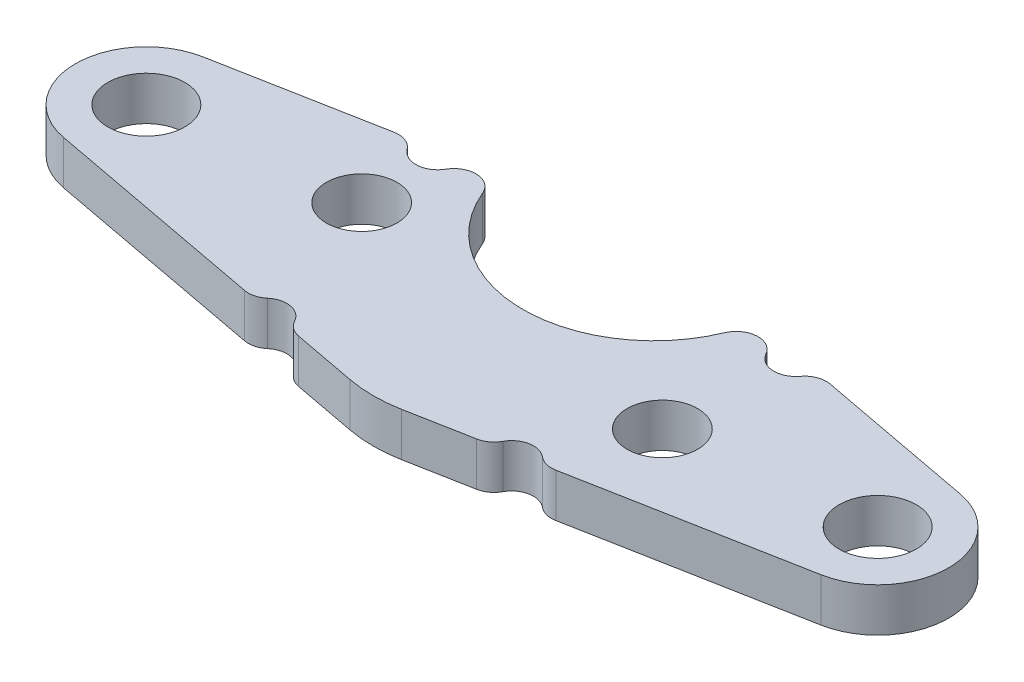
ISO-10303-21;
HEADER;
FILE_DESCRIPTION(('STEP AP214'),'2;1');
FILE_NAME('part.step','',(''),(''),'','','');
FILE_SCHEMA(('AUTOMOTIVE_DESIGN { 1 0 10303 214 1 1 1 1 }'));
ENDSEC;
DATA;
#1=APPLICATION_CONTEXT('core data for automotive mechanical design processes');
#2=APPLICATION_PROTOCOL_DEFINITION('international standard','automotive_design',2000,#1);
#3=PRODUCT_CONTEXT('',#1,'mechanical');
#4=PRODUCT('Part','Part','',(#3));
#5=PRODUCT_RELATED_PRODUCT_CATEGORY('part','',(#4));
#6=PRODUCT_DEFINITION_FORMATION('','',#4);
#7=PRODUCT_DEFINITION_CONTEXT('part definition',#1,'design');
#8=PRODUCT_DEFINITION('design','',#6,#7);
#9=PRODUCT_DEFINITION_SHAPE('','',#8);
#10=(LENGTH_UNIT() NAMED_UNIT(*) SI_UNIT(.MILLI.,.METRE.));
#11=(NAMED_UNIT(*) PLANE_ANGLE_UNIT() SI_UNIT($,.RADIAN.));
#12=(NAMED_UNIT(*) SI_UNIT($,.STERADIAN.) SOLID_ANGLE_UNIT());
#13=UNCERTAINTY_MEASURE_WITH_UNIT(LENGTH_MEASURE(1.E-05),#10,'distance_accuracy_value','');
#14=(GEOMETRIC_REPRESENTATION_CONTEXT(3) GLOBAL_UNCERTAINTY_ASSIGNED_CONTEXT((#13)) GLOBAL_UNIT_ASSIGNED_CONTEXT((#10,
#11,#12)) REPRESENTATION_CONTEXT('',''));
#15=CARTESIAN_POINT('',(0.,0.,0.));
#16=DIRECTION('',(0.,0.,1.));
#17=DIRECTION('',(1.,0.,0.));
#18=AXIS2_PLACEMENT_3D('',#15,#16,#17);
#19=CARTESIAN_POINT('',(-6.46165739404907,0.,-3.80797776347762));
#20=DIRECTION('',(0.,1.,0.));
#21=DIRECTION('',(-0.923093913435582,0.,0.384574605217483));
#22=AXIS2_PLACEMENT_3D('',#19,#20,#21);
#23=CYLINDRICAL_SURFACE('',#22,1.);
#24=CARTESIAN_POINT('',(-6.46165739404907,0.,-3.80797776347762));
#25=DIRECTION('',(0.,1.,0.));
#26=DIRECTION('',(-0.923093913435582,0.,0.384574605217483));
#27=AXIS2_PLACEMENT_3D('',#24,#25,#26);
#28=CIRCLE('',#27,1.);
#29=CARTESIAN_POINT('',(-5.53856348061349,0.,-4.1925523686951));
#30=VERTEX_POINT('',#29);
#31=CARTESIAN_POINT('',(-7.33082869702453,0.,-4.30248888173881));
#32=VERTEX_POINT('',#31);
#33=EDGE_CURVE('E11',#30,#32,#28,.T.);
#34=ORIENTED_EDGE('',*,*,#33,.T.);
#35=DIRECTION('',(0.,1.,0.));
#36=VECTOR('',#35,1.);
#37=CARTESIAN_POINT('',(-7.33082869702453,0.,-4.30248888173881));
#38=LINE('',#37,#36);
#39=CARTESIAN_POINT('',(-7.33082869702453,2.,-4.30248888173881));
#40=VERTEX_POINT('',#39);
#41=EDGE_CURVE('E50',#32,#40,#38,.T.);
#42=ORIENTED_EDGE('',*,*,#41,.T.);
#43=CARTESIAN_POINT('',(-6.46165739404907,2.,-3.80797776347762));
#44=DIRECTION('',(0.,-1.,0.));
#45=DIRECTION('',(-0.923093913435582,0.,0.384574605217483));
#46=AXIS2_PLACEMENT_3D('',#43,#44,#45);
#47=CIRCLE('',#46,1.);
#48=CARTESIAN_POINT('',(-5.53856348061349,2.,-4.1925523686951));
#49=VERTEX_POINT('',#48);
#50=EDGE_CURVE('E244',#40,#49,#47,.T.);
#51=ORIENTED_EDGE('',*,*,#50,.T.);
#52=DIRECTION('',(0.,-1.,0.));
#53=VECTOR('',#52,1.);
#54=CARTESIAN_POINT('',(-5.53856348061349,0.,-4.1925523686951));
#55=LINE('',#54,#53);
#56=EDGE_CURVE('E242',#49,#30,#55,.T.);
#57=ORIENTED_EDGE('',*,*,#56,.T.);
#58=EDGE_LOOP('',(#34,#42,#51,#57));
#59=FACE_BOUND('',#58,.T.);
#60=ADVANCED_FACE('F40',(#59),#23,.T.);
#61=CARTESIAN_POINT('',(-8.2,0.,-4.797));
#62=DIRECTION('',(0.,1.,0.));
#63=DIRECTION('',(1.,0.,0.));
#64=AXIS2_PLACEMENT_3D('',#61,#62,#63);
#65=CYLINDRICAL_SURFACE('',#64,1.);
#66=ORIENTED_EDGE('',*,*,#41,.F.);
#67=CARTESIAN_POINT('',(-8.2,0.,-4.797));
#68=DIRECTION('',(0.,1.,0.));
#69=DIRECTION('',(1.,0.,0.));
#70=AXIS2_PLACEMENT_3D('',#67,#68,#69);
#71=CIRCLE('',#70,1.);
#72=CARTESIAN_POINT('',(-9.00038306399776,0.,-4.19751109195786));
#73=VERTEX_POINT('',#72);
#74=EDGE_CURVE('E251',#73,#32,#71,.T.);
#75=ORIENTED_EDGE('',*,*,#74,.F.);
#76=DIRECTION('',(0.,-1.,0.));
#77=VECTOR('',#76,1.);
#78=CARTESIAN_POINT('',(-9.00038306399776,0.,-4.19751109195786));
#79=LINE('',#78,#77);
#80=CARTESIAN_POINT('',(-9.00038306399776,2.,-4.19751109195786));
#81=VERTEX_POINT('',#80);
#82=EDGE_CURVE('E335',#81,#73,#79,.T.);
#83=ORIENTED_EDGE('',*,*,#82,.F.);
#84=CARTESIAN_POINT('',(-8.2,2.,-4.797));
#85=DIRECTION('',(0.,-1.,0.));
#86=DIRECTION('',(1.,0.,0.));
#87=AXIS2_PLACEMENT_3D('',#84,#85,#86);
#88=CIRCLE('',#87,1.);
#89=EDGE_CURVE('E296',#40,#81,#88,.T.);
#90=ORIENTED_EDGE('',*,*,#89,.F.);
#91=EDGE_LOOP('',(#66,#75,#83,#90));
#92=FACE_BOUND('',#91,.T.);
#93=ADVANCED_FACE('F422',(#92),#65,.F.);
#94=CARTESIAN_POINT('',(-16.75,0.,0.));
#95=DIRECTION('',(0.,1.,0.));
#96=DIRECTION('',(1.,0.,0.));
#97=AXIS2_PLACEMENT_3D('',#94,#95,#96);
#98=PLANE('',#97);
#99=CARTESIAN_POINT('',(-16.75,0.,0.));
#100=DIRECTION('',(0.,1.,0.));
#101=DIRECTION('',(0.,0.,1.));
#102=AXIS2_PLACEMENT_3D('',#99,#100,#101);
#103=CIRCLE('',#102,1.76644);
#104=CARTESIAN_POINT('',(-16.75,0.,1.76644));
#105=VERTEX_POINT('',#104);
#106=EDGE_CURVE('E469',#105,#105,#103,.T.);
#107=ORIENTED_EDGE('',*,*,#106,.T.);
#108=EDGE_LOOP('',(#107));
#109=FACE_BOUND('',#108,.T.);
#110=CARTESIAN_POINT('',(16.75,0.,0.));
#111=DIRECTION('',(0.,1.,0.));
#112=DIRECTION('',(0.,0.,1.));
#113=AXIS2_PLACEMENT_3D('',#110,#111,#112);
#114=CIRCLE('',#113,1.76644);
#115=CARTESIAN_POINT('',(16.75,0.,1.76644));
#116=VERTEX_POINT('',#115);
#117=EDGE_CURVE('E473',#116,#116,#114,.T.);
#118=ORIENTED_EDGE('',*,*,#117,.T.);
#119=EDGE_LOOP('',(#118));
#120=FACE_BOUND('',#119,.T.);
#121=CARTESIAN_POINT('',(7.93155889099048,0.,1.04420953776041));
#122=DIRECTION('',(0.,1.,0.));
#123=DIRECTION('',(0.,0.,1.));
#124=AXIS2_PLACEMENT_3D('',#121,#122,#123);
#125=CIRCLE('',#124,1.61743);
#126=CARTESIAN_POINT('',(7.93155889099048,0.,2.66163953776041));
#127=VERTEX_POINT('',#126);
#128=EDGE_CURVE('E477',#127,#127,#125,.T.);
#129=ORIENTED_EDGE('',*,*,#128,.T.);
#130=EDGE_LOOP('',(#129));
#131=FACE_BOUND('',#130,.T.);
#132=CARTESIAN_POINT('',(-7.93155889099048,0.,-1.04420953776041));
#133=DIRECTION('',(0.,1.,0.));
#134=DIRECTION('',(0.,0.,1.));
#135=AXIS2_PLACEMENT_3D('',#132,#133,#134);
#136=CIRCLE('',#135,1.61743);
#137=CARTESIAN_POINT('',(-7.93155889099048,0.,0.57322046223959));
#138=VERTEX_POINT('',#137);
#139=EDGE_CURVE('E375',#138,#138,#136,.T.);
#140=ORIENTED_EDGE('',*,*,#139,.T.);
#141=EDGE_LOOP('',(#140));
#142=FACE_BOUND('',#141,.T.);
#143=ORIENTED_EDGE('',*,*,#33,.F.);
#144=CARTESIAN_POINT('',(0.,0.,-6.5));
#145=DIRECTION('',(0.,1.,0.));
#146=DIRECTION('',(1.,0.,0.));
#147=AXIS2_PLACEMENT_3D('',#144,#145,#146);
#148=CIRCLE('',#147,6.);
#149=CARTESIAN_POINT('',(5.53856348061349,0.,-4.1925523686951));
#150=VERTEX_POINT('',#149);
#151=EDGE_CURVE('E245',#30,#150,#148,.T.);
#152=ORIENTED_EDGE('',*,*,#151,.T.);
#153=CARTESIAN_POINT('',(6.46165739404907,0.,-3.80797776347762));
#154=DIRECTION('',(0.,1.,0.));
#155=DIRECTION('',(-0.869171302975464,0.,0.494511118261191));
#156=AXIS2_PLACEMENT_3D('',#153,#154,#155);
#157=CIRCLE('',#156,1.);
#158=CARTESIAN_POINT('',(7.33082869702454,0.,-4.30248888173881));
#159=VERTEX_POINT('',#158);
#160=EDGE_CURVE('E292',#159,#150,#157,.T.);
#161=ORIENTED_EDGE('',*,*,#160,.F.);
#162=CARTESIAN_POINT('',(8.2,0.,-4.797));
#163=DIRECTION('',(0.,1.,0.));
#164=DIRECTION('',(1.,0.,0.));
#165=AXIS2_PLACEMENT_3D('',#162,#163,#164);
#166=CIRCLE('',#165,1.);
#167=CARTESIAN_POINT('',(9.00038306399776,0.,-4.19751109195786));
#168=VERTEX_POINT('',#167);
#169=EDGE_CURVE('E323',#159,#168,#166,.T.);
#170=ORIENTED_EDGE('',*,*,#169,.T.);
#171=CARTESIAN_POINT('',(9.80076612799552,0.,-3.59802218391572));
#172=DIRECTION('',(0.,1.,0.));
#173=DIRECTION('',(-0.362464232443819,0.,-0.931997682507265));
#174=AXIS2_PLACEMENT_3D('',#171,#172,#173);
#175=CIRCLE('',#174,1.);
#176=CARTESIAN_POINT('',(9.9858063465176,0.,-4.58075313261394));
#177=VERTEX_POINT('',#176);
#178=EDGE_CURVE('E231',#177,#168,#175,.T.);
#179=ORIENTED_EDGE('',*,*,#178,.F.);
#180=DIRECTION('',(-0.982730948698219,0.,-0.185040218522078));
#181=VECTOR('',#180,1.);
#182=CARTESIAN_POINT('',(17.3513807101968,0.,-3.19387558326921));
#183=LINE('',#182,#181);
#184=CARTESIAN_POINT('',(17.3513807101968,0.,-3.19387558326921));
#185=VERTEX_POINT('',#184);
#186=EDGE_CURVE('E209',#185,#177,#183,.T.);
#187=ORIENTED_EDGE('',*,*,#186,.F.);
#188=CARTESIAN_POINT('',(16.75,0.,0.));
#189=DIRECTION('',(0.,1.,0.));
#190=DIRECTION('',(1.,0.,0.));
#191=AXIS2_PLACEMENT_3D('',#188,#189,#190);
#192=CIRCLE('',#191,3.25);
#193=CARTESIAN_POINT('',(17.3513807101968,0.,3.19387558326921));
#194=VERTEX_POINT('',#193);
#195=EDGE_CURVE('E205',#194,#185,#192,.T.);
#196=ORIENTED_EDGE('',*,*,#195,.F.);
#197=DIRECTION('',(0.982730948698219,0.,-0.185040218522078));
#198=VECTOR('',#197,1.);
#199=CARTESIAN_POINT('',(1.17489874158095,0.,6.2397751373193));
#200=LINE('',#199,#198);
#201=CARTESIAN_POINT('',(7.12605313628814,0.,5.11922132641718));
#202=VERTEX_POINT('',#201);
#203=EDGE_CURVE('E191',#202,#194,#200,.T.);
#204=ORIENTED_EDGE('',*,*,#203,.F.);
#205=CARTESIAN_POINT('',(6.94101291776606,0.,4.13649037771896));
#206=DIRECTION('',(0.,1.,0.));
#207=DIRECTION('',(-0.254941026186371,0.,0.966956603559353));
#208=AXIS2_PLACEMENT_3D('',#205,#206,#207);
#209=CIRCLE('',#208,1.);
#210=CARTESIAN_POINT('',(6.29550645888303,0.,4.90024518885948));
#211=VERTEX_POINT('',#210);
#212=EDGE_CURVE('E259',#211,#202,#209,.T.);
#213=ORIENTED_EDGE('',*,*,#212,.F.);
#214=CARTESIAN_POINT('',(5.65,0.,5.664));
#215=DIRECTION('',(0.,1.,0.));
#216=DIRECTION('',(1.,0.,0.));
#217=AXIS2_PLACEMENT_3D('',#214,#215,#216);
#218=CIRCLE('',#217,1.);
#219=CARTESIAN_POINT('',(4.77092806707373,0.,5.1873108594259));
#220=VERTEX_POINT('',#219);
#221=EDGE_CURVE('E320',#211,#220,#218,.T.);
#222=ORIENTED_EDGE('',*,*,#221,.T.);
#223=CARTESIAN_POINT('',(3.89185613414746,0.,4.71062171885181));
#224=DIRECTION('',(0.,1.,0.));
#225=DIRECTION('',(0.589154687333803,0.,0.808020268553091));
#226=AXIS2_PLACEMENT_3D('',#223,#224,#225);
#227=CIRCLE('',#226,1.);
#228=CARTESIAN_POINT('',(4.07689635266954,0.,5.69335266755003));
#229=VERTEX_POINT('',#228);
#230=EDGE_CURVE('E226',#229,#220,#227,.T.);
#231=ORIENTED_EDGE('',*,*,#230,.F.);
#232=DIRECTION('',(0.982730948698219,0.,-0.185040218522078));
#233=VECTOR('',#232,1.);
#234=CARTESIAN_POINT('',(1.17489874158095,0.,6.2397751373193));
#235=LINE('',#234,#233);
#236=CARTESIAN_POINT('',(1.17489874158095,0.,6.2397751373193));
#237=VERTEX_POINT('',#236);
#238=EDGE_CURVE('E218',#237,#229,#235,.T.);
#239=ORIENTED_EDGE('',*,*,#238,.F.);
#240=CARTESIAN_POINT('',(0.,0.,0.));
#241=DIRECTION('',(0.,1.,0.));
#242=DIRECTION('',(1.,0.,0.));
#243=AXIS2_PLACEMENT_3D('',#240,#241,#242);
#244=CIRCLE('',#243,6.34942366024481);
#245=CARTESIAN_POINT('',(-1.17489874158095,0.,6.2397751373193));
#246=VERTEX_POINT('',#245);
#247=EDGE_CURVE('E220',#246,#237,#244,.T.);
#248=ORIENTED_EDGE('',*,*,#247,.F.);
#249=DIRECTION('',(-0.982730948698219,0.,-0.185040218522078));
#250=VECTOR('',#249,1.);
#251=CARTESIAN_POINT('',(-1.17489874158095,0.,6.2397751373193));
#252=LINE('',#251,#250);
#253=CARTESIAN_POINT('',(-4.07689635266954,0.,5.69335266755003));
#254=VERTEX_POINT('',#253);
#255=EDGE_CURVE('E324',#246,#254,#252,.T.);
#256=ORIENTED_EDGE('',*,*,#255,.T.);
#257=CARTESIAN_POINT('',(-3.89185613414746,0.,4.71062171885181));
#258=DIRECTION('',(0.,1.,0.));
#259=DIRECTION('',(-0.589154687333803,0.,0.808020268553091));
#260=AXIS2_PLACEMENT_3D('',#257,#258,#259);
#261=CIRCLE('',#260,1.);
#262=CARTESIAN_POINT('',(-4.77092806707373,0.,5.1873108594259));
#263=VERTEX_POINT('',#262);
#264=EDGE_CURVE('E250',#263,#254,#261,.T.);
#265=ORIENTED_EDGE('',*,*,#264,.F.);
#266=CARTESIAN_POINT('',(-5.65,0.,5.664));
#267=DIRECTION('',(0.,1.,0.));
#268=DIRECTION('',(1.,0.,0.));
#269=AXIS2_PLACEMENT_3D('',#266,#267,#268);
#270=CIRCLE('',#269,1.);
#271=CARTESIAN_POINT('',(-6.29550645888303,0.,4.90024518885948));
#272=VERTEX_POINT('',#271);
#273=EDGE_CURVE('E263',#263,#272,#270,.T.);
#274=ORIENTED_EDGE('',*,*,#273,.T.);
#275=CARTESIAN_POINT('',(-6.94101291776606,0.,4.13649037771896));
#276=DIRECTION('',(0.,1.,0.));
#277=DIRECTION('',(0.254941026186371,0.,0.966956603559353));
#278=AXIS2_PLACEMENT_3D('',#275,#276,#277);
#279=CIRCLE('',#278,1.);
#280=CARTESIAN_POINT('',(-7.12605313628814,0.,5.11922132641718));
#281=VERTEX_POINT('',#280);
#282=EDGE_CURVE('E306',#281,#272,#279,.T.);
#283=ORIENTED_EDGE('',*,*,#282,.F.);
#284=DIRECTION('',(-0.982730948698219,0.,-0.185040218522078));
#285=VECTOR('',#284,1.);
#286=CARTESIAN_POINT('',(-1.17489874158095,0.,6.2397751373193));
#287=LINE('',#286,#285);
#288=CARTESIAN_POINT('',(-17.3513807101968,0.,3.19387558326921));
#289=VERTEX_POINT('',#288);
#290=EDGE_CURVE('E260',#281,#289,#287,.T.);
#291=ORIENTED_EDGE('',*,*,#290,.T.);
#292=CARTESIAN_POINT('',(-16.75,0.,0.));
#293=DIRECTION('',(0.,1.,0.));
#294=DIRECTION('',(1.,0.,0.));
#295=AXIS2_PLACEMENT_3D('',#292,#293,#294);
#296=CIRCLE('',#295,3.25);
#297=CARTESIAN_POINT('',(-17.3513807101968,0.,-3.19387558326921));
#298=VERTEX_POINT('',#297);
#299=EDGE_CURVE('E312',#298,#289,#296,.T.);
#300=ORIENTED_EDGE('',*,*,#299,.F.);
#301=DIRECTION('',(0.982730948698219,0.,-0.185040218522078));
#302=VECTOR('',#301,1.);
#303=CARTESIAN_POINT('',(-17.3513807101968,0.,-3.19387558326921));
#304=LINE('',#303,#302);
#305=CARTESIAN_POINT('',(-9.9858063465176,0.,-4.58075313261394));
#306=VERTEX_POINT('',#305);
#307=EDGE_CURVE('E254',#298,#306,#304,.T.);
#308=ORIENTED_EDGE('',*,*,#307,.T.);
#309=CARTESIAN_POINT('',(-9.80076612799552,0.,-3.59802218391572));
#310=DIRECTION('',(0.,1.,0.));
#311=DIRECTION('',(0.362464232443819,0.,-0.931997682507265));
#312=AXIS2_PLACEMENT_3D('',#309,#310,#311);
#313=CIRCLE('',#312,1.);
#314=EDGE_CURVE('E241',#73,#306,#313,.T.);
#315=ORIENTED_EDGE('',*,*,#314,.F.);
#316=ORIENTED_EDGE('',*,*,#74,.T.);
#317=EDGE_LOOP('',(#143,#152,#161,#170,#179,#187,#196,#204,#213,#222,#231,#239,#248,#256,#265,
#274,#283,#291,#300,#308,#315,#316));
#318=FACE_BOUND('',#317,.T.);
#319=ADVANCED_FACE('F207',(#109,#120,#131,#142,#318),#98,.F.);
#320=CARTESIAN_POINT('',(9.80076612799552,0.,-3.59802218391572));
#321=DIRECTION('',(0.,1.,0.));
#322=DIRECTION('',(-0.362464232443819,0.,-0.931997682507265));
#323=AXIS2_PLACEMENT_3D('',#320,#321,#322);
#324=CYLINDRICAL_SURFACE('',#323,1.);
#325=CARTESIAN_POINT('',(9.80076612799552,2.,-3.59802218391572));
#326=DIRECTION('',(0.,-1.,0.));
#327=DIRECTION('',(-0.362464232443819,0.,-0.931997682507265));
#328=AXIS2_PLACEMENT_3D('',#325,#326,#327);
#329=CIRCLE('',#328,1.);
#330=CARTESIAN_POINT('',(9.00038306399776,2.,-4.19751109195786));
#331=VERTEX_POINT('',#330);
#332=CARTESIAN_POINT('',(9.9858063465176,2.,-4.58075313261394));
#333=VERTEX_POINT('',#332);
#334=EDGE_CURVE('E237',#331,#333,#329,.T.);
#335=ORIENTED_EDGE('',*,*,#334,.T.);
#336=DIRECTION('',(0.,-1.,0.));
#337=VECTOR('',#336,1.);
#338=CARTESIAN_POINT('',(9.9858063465176,0.,-4.58075313261394));
#339=LINE('',#338,#337);
#340=EDGE_CURVE('E233',#333,#177,#339,.T.);
#341=ORIENTED_EDGE('',*,*,#340,.T.);
#342=ORIENTED_EDGE('',*,*,#178,.T.);
#343=DIRECTION('',(0.,1.,0.));
#344=VECTOR('',#343,1.);
#345=CARTESIAN_POINT('',(9.00038306399776,0.,-4.19751109195786));
#346=LINE('',#345,#344);
#347=EDGE_CURVE('E234',#168,#331,#346,.T.);
#348=ORIENTED_EDGE('',*,*,#347,.T.);
#349=EDGE_LOOP('',(#335,#341,#342,#348));
#350=FACE_BOUND('',#349,.T.);
#351=ADVANCED_FACE('F438',(#350),#324,.T.);
#352=CARTESIAN_POINT('',(8.2,0.,-4.797));
#353=DIRECTION('',(0.,1.,0.));
#354=DIRECTION('',(1.,0.,0.));
#355=AXIS2_PLACEMENT_3D('',#352,#353,#354);
#356=CYLINDRICAL_SURFACE('',#355,1.);
#357=ORIENTED_EDGE('',*,*,#347,.F.);
#358=ORIENTED_EDGE('',*,*,#169,.F.);
#359=DIRECTION('',(0.,-1.,0.));
#360=VECTOR('',#359,1.);
#361=CARTESIAN_POINT('',(7.33082869702454,0.,-4.30248888173881));
#362=LINE('',#361,#360);
#363=CARTESIAN_POINT('',(7.33082869702454,2.,-4.30248888173881));
#364=VERTEX_POINT('',#363);
#365=EDGE_CURVE('E276',#364,#159,#362,.T.);
#366=ORIENTED_EDGE('',*,*,#365,.F.);
#367=CARTESIAN_POINT('',(8.2,2.,-4.797));
#368=DIRECTION('',(0.,-1.,0.));
#369=DIRECTION('',(1.,0.,0.));
#370=AXIS2_PLACEMENT_3D('',#367,#368,#369);
#371=CIRCLE('',#370,1.);
#372=EDGE_CURVE('E300',#331,#364,#371,.T.);
#373=ORIENTED_EDGE('',*,*,#372,.F.);
#374=EDGE_LOOP('',(#357,#358,#366,#373));
#375=FACE_BOUND('',#374,.T.);
#376=ADVANCED_FACE('F436',(#375),#356,.F.);
#377=CARTESIAN_POINT('',(0.,0.,-6.5));
#378=DIRECTION('',(0.,1.,0.));
#379=DIRECTION('',(1.,0.,0.));
#380=AXIS2_PLACEMENT_3D('',#377,#378,#379);
#381=CYLINDRICAL_SURFACE('',#380,6.);
#382=ORIENTED_EDGE('',*,*,#56,.F.);
#383=CARTESIAN_POINT('',(0.,2.,-6.5));
#384=DIRECTION('',(0.,-1.,0.));
#385=DIRECTION('',(1.,0.,0.));
#386=AXIS2_PLACEMENT_3D('',#383,#384,#385);
#387=CIRCLE('',#386,6.);
#388=CARTESIAN_POINT('',(5.53856348061349,2.,-4.1925523686951));
#389=VERTEX_POINT('',#388);
#390=EDGE_CURVE('E304',#389,#49,#387,.T.);
#391=ORIENTED_EDGE('',*,*,#390,.F.);
#392=DIRECTION('',(0.,1.,0.));
#393=VECTOR('',#392,1.);
#394=CARTESIAN_POINT('',(5.53856348061349,0.,-4.1925523686951));
#395=LINE('',#394,#393);
#396=EDGE_CURVE('E289',#150,#389,#395,.T.);
#397=ORIENTED_EDGE('',*,*,#396,.F.);
#398=ORIENTED_EDGE('',*,*,#151,.F.);
#399=EDGE_LOOP('',(#382,#391,#397,#398));
#400=FACE_BOUND('',#399,.T.);
#401=ADVANCED_FACE('F42',(#400),#381,.F.);
#402=CARTESIAN_POINT('',(6.46165739404907,0.,-3.80797776347762));
#403=DIRECTION('',(0.,1.,0.));
#404=DIRECTION('',(-0.869171302975464,0.,0.494511118261191));
#405=AXIS2_PLACEMENT_3D('',#402,#403,#404);
#406=CYLINDRICAL_SURFACE('',#405,1.);
#407=ORIENTED_EDGE('',*,*,#160,.T.);
#408=ORIENTED_EDGE('',*,*,#396,.T.);
#409=CARTESIAN_POINT('',(6.46165739404907,2.,-3.80797776347762));
#410=DIRECTION('',(0.,-1.,0.));
#411=DIRECTION('',(-0.869171302975464,0.,0.494511118261191));
#412=AXIS2_PLACEMENT_3D('',#409,#410,#411);
#413=CIRCLE('',#412,1.);
#414=EDGE_CURVE('E279',#389,#364,#413,.T.);
#415=ORIENTED_EDGE('',*,*,#414,.T.);
#416=ORIENTED_EDGE('',*,*,#365,.T.);
#417=EDGE_LOOP('',(#407,#408,#415,#416));
#418=FACE_BOUND('',#417,.T.);
#419=ADVANCED_FACE('F429',(#418),#406,.T.);
#420=CARTESIAN_POINT('',(6.94101291776606,0.,4.13649037771896));
#421=DIRECTION('',(0.,1.,0.));
#422=DIRECTION('',(-0.254941026186371,0.,0.966956603559353));
#423=AXIS2_PLACEMENT_3D('',#420,#421,#422);
#424=CYLINDRICAL_SURFACE('',#423,1.);
#425=CARTESIAN_POINT('',(6.94101291776606,2.,4.13649037771896));
#426=DIRECTION('',(0.,-1.,0.));
#427=DIRECTION('',(-0.254941026186371,0.,0.966956603559353));
#428=AXIS2_PLACEMENT_3D('',#425,#426,#427);
#429=CIRCLE('',#428,1.);
#430=CARTESIAN_POINT('',(7.12605313628814,2.,5.11922132641718));
#431=VERTEX_POINT('',#430);
#432=CARTESIAN_POINT('',(6.29550645888303,2.,4.90024518885948));
#433=VERTEX_POINT('',#432);
#434=EDGE_CURVE('E258',#431,#433,#429,.T.);
#435=ORIENTED_EDGE('',*,*,#434,.T.);
#436=DIRECTION('',(0.,-1.,0.));
#437=VECTOR('',#436,1.);
#438=CARTESIAN_POINT('',(6.29550645888303,0.,4.90024518885948));
#439=LINE('',#438,#437);
#440=EDGE_CURVE('E255',#433,#211,#439,.T.);
#441=ORIENTED_EDGE('',*,*,#440,.T.);
#442=ORIENTED_EDGE('',*,*,#212,.T.);
#443=DIRECTION('',(0.,1.,0.));
#444=VECTOR('',#443,1.);
#445=CARTESIAN_POINT('',(7.12605313628814,0.,5.11922132641718));
#446=LINE('',#445,#444);
#447=EDGE_CURVE('E198',#202,#431,#446,.T.);
#448=ORIENTED_EDGE('',*,*,#447,.T.);
#449=EDGE_LOOP('',(#435,#441,#442,#448));
#450=FACE_BOUND('',#449,.T.);
#451=ADVANCED_FACE('F442',(#450),#424,.T.);
#452=CARTESIAN_POINT('',(5.65,0.,5.664));
#453=DIRECTION('',(0.,1.,0.));
#454=DIRECTION('',(1.,0.,0.));
#455=AXIS2_PLACEMENT_3D('',#452,#453,#454);
#456=CYLINDRICAL_SURFACE('',#455,1.);
#457=ORIENTED_EDGE('',*,*,#440,.F.);
#458=CARTESIAN_POINT('',(5.65,2.,5.664));
#459=DIRECTION('',(0.,-1.,0.));
#460=DIRECTION('',(1.,0.,0.));
#461=AXIS2_PLACEMENT_3D('',#458,#459,#460);
#462=CIRCLE('',#461,1.);
#463=CARTESIAN_POINT('',(4.77092806707373,2.,5.1873108594259));
#464=VERTEX_POINT('',#463);
#465=EDGE_CURVE('E264',#464,#433,#462,.T.);
#466=ORIENTED_EDGE('',*,*,#465,.F.);
#467=DIRECTION('',(0.,1.,0.));
#468=VECTOR('',#467,1.);
#469=CARTESIAN_POINT('',(4.77092806707373,0.,5.1873108594259));
#470=LINE('',#469,#468);
#471=EDGE_CURVE('E230',#220,#464,#470,.T.);
#472=ORIENTED_EDGE('',*,*,#471,.F.);
#473=ORIENTED_EDGE('',*,*,#221,.F.);
#474=EDGE_LOOP('',(#457,#466,#472,#473));
#475=FACE_BOUND('',#474,.T.);
#476=ADVANCED_FACE('F415',(#475),#456,.F.);
#477=CARTESIAN_POINT('',(3.89185613414746,0.,4.71062171885181));
#478=DIRECTION('',(0.,1.,0.));
#479=DIRECTION('',(0.589154687333803,0.,0.808020268553091));
#480=AXIS2_PLACEMENT_3D('',#477,#478,#479);
#481=CYLINDRICAL_SURFACE('',#480,1.);
#482=CARTESIAN_POINT('',(3.89185613414746,2.,4.71062171885181));
#483=DIRECTION('',(0.,-1.,0.));
#484=DIRECTION('',(0.589154687333803,0.,0.808020268553091));
#485=AXIS2_PLACEMENT_3D('',#482,#483,#484);
#486=CIRCLE('',#485,1.);
#487=CARTESIAN_POINT('',(4.07689635266954,2.,5.69335266755003));
#488=VERTEX_POINT('',#487);
#489=EDGE_CURVE('E272',#464,#488,#486,.T.);
#490=ORIENTED_EDGE('',*,*,#489,.T.);
#491=DIRECTION('',(0.,-1.,0.));
#492=VECTOR('',#491,1.);
#493=CARTESIAN_POINT('',(4.07689635266954,0.,5.69335266755003));
#494=LINE('',#493,#492);
#495=EDGE_CURVE('E229',#488,#229,#494,.T.);
#496=ORIENTED_EDGE('',*,*,#495,.T.);
#497=ORIENTED_EDGE('',*,*,#230,.T.);
#498=ORIENTED_EDGE('',*,*,#471,.T.);
#499=EDGE_LOOP('',(#490,#496,#497,#498));
#500=FACE_BOUND('',#499,.T.);
#501=ADVANCED_FACE('F411',(#500),#481,.T.);
#502=CARTESIAN_POINT('',(-6.94101291776606,0.,4.13649037771896));
#503=DIRECTION('',(0.,1.,0.));
#504=DIRECTION('',(0.254941026186371,0.,0.966956603559353));
#505=AXIS2_PLACEMENT_3D('',#502,#503,#504);
#506=CYLINDRICAL_SURFACE('',#505,1.);
#507=CARTESIAN_POINT('',(-6.94101291776606,2.,4.13649037771896));
#508=DIRECTION('',(0.,-1.,0.));
#509=DIRECTION('',(0.254941026186371,0.,0.966956603559353));
#510=AXIS2_PLACEMENT_3D('',#507,#508,#509);
#511=CIRCLE('',#510,1.);
#512=CARTESIAN_POINT('',(-6.29550645888303,2.,4.90024518885948));
#513=VERTEX_POINT('',#512);
#514=CARTESIAN_POINT('',(-7.12605313628814,2.,5.11922132641718));
#515=VERTEX_POINT('',#514);
#516=EDGE_CURVE('E282',#513,#515,#511,.T.);
#517=ORIENTED_EDGE('',*,*,#516,.T.);
#518=DIRECTION('',(0.,-1.,0.));
#519=VECTOR('',#518,1.);
#520=CARTESIAN_POINT('',(-7.12605313628814,0.,5.11922132641718));
#521=LINE('',#520,#519);
#522=EDGE_CURVE('E308',#515,#281,#521,.T.);
#523=ORIENTED_EDGE('',*,*,#522,.T.);
#524=ORIENTED_EDGE('',*,*,#282,.T.);
#525=DIRECTION('',(0.,1.,0.));
#526=VECTOR('',#525,1.);
#527=CARTESIAN_POINT('',(-6.29550645888303,0.,4.90024518885948));
#528=LINE('',#527,#526);
#529=EDGE_CURVE('E162',#272,#513,#528,.T.);
#530=ORIENTED_EDGE('',*,*,#529,.T.);
#531=EDGE_LOOP('',(#517,#523,#524,#530));
#532=FACE_BOUND('',#531,.T.);
#533=ADVANCED_FACE('F384',(#532),#506,.T.);
#534=CARTESIAN_POINT('',(-5.65,0.,5.664));
#535=DIRECTION('',(0.,1.,0.));
#536=DIRECTION('',(1.,0.,0.));
#537=AXIS2_PLACEMENT_3D('',#534,#535,#536);
#538=CYLINDRICAL_SURFACE('',#537,1.);
#539=ORIENTED_EDGE('',*,*,#529,.F.);
#540=ORIENTED_EDGE('',*,*,#273,.F.);
#541=DIRECTION('',(0.,-1.,0.));
#542=VECTOR('',#541,1.);
#543=CARTESIAN_POINT('',(-4.77092806707373,0.,5.1873108594259));
#544=LINE('',#543,#542);
#545=CARTESIAN_POINT('',(-4.77092806707373,2.,5.1873108594259));
#546=VERTEX_POINT('',#545);
#547=EDGE_CURVE('E246',#546,#263,#544,.T.);
#548=ORIENTED_EDGE('',*,*,#547,.F.);
#549=CARTESIAN_POINT('',(-5.65,2.,5.664));
#550=DIRECTION('',(0.,-1.,0.));
#551=DIRECTION('',(1.,0.,0.));
#552=AXIS2_PLACEMENT_3D('',#549,#550,#551);
#553=CIRCLE('',#552,1.);
#554=EDGE_CURVE('E169',#513,#546,#553,.T.);
#555=ORIENTED_EDGE('',*,*,#554,.F.);
#556=EDGE_LOOP('',(#539,#540,#548,#555));
#557=FACE_BOUND('',#556,.T.);
#558=ADVANCED_FACE('F391',(#557),#538,.F.);
#559=CARTESIAN_POINT('',(-3.89185613414746,0.,4.71062171885181));
#560=DIRECTION('',(0.,1.,0.));
#561=DIRECTION('',(-0.589154687333803,0.,0.808020268553091));
#562=AXIS2_PLACEMENT_3D('',#559,#560,#561);
#563=CYLINDRICAL_SURFACE('',#562,1.);
#564=CARTESIAN_POINT('',(-3.89185613414746,2.,4.71062171885181));
#565=DIRECTION('',(0.,-1.,0.));
#566=DIRECTION('',(-0.589154687333803,0.,0.808020268553091));
#567=AXIS2_PLACEMENT_3D('',#564,#565,#566);
#568=CIRCLE('',#567,1.);
#569=CARTESIAN_POINT('',(-4.07689635266954,2.,5.69335266755003));
#570=VERTEX_POINT('',#569);
#571=EDGE_CURVE('E249',#570,#546,#568,.T.);
#572=ORIENTED_EDGE('',*,*,#571,.T.);
#573=ORIENTED_EDGE('',*,*,#547,.T.);
#574=ORIENTED_EDGE('',*,*,#264,.T.);
#575=DIRECTION('',(0.,1.,0.));
#576=VECTOR('',#575,1.);
#577=CARTESIAN_POINT('',(-4.07689635266954,0.,5.69335266755003));
#578=LINE('',#577,#576);
#579=EDGE_CURVE('E286',#254,#570,#578,.T.);
#580=ORIENTED_EDGE('',*,*,#579,.T.);
#581=EDGE_LOOP('',(#572,#573,#574,#580));
#582=FACE_BOUND('',#581,.T.);
#583=ADVANCED_FACE('F393',(#582),#563,.T.);
#584=CARTESIAN_POINT('',(-4.65313718558666,0.,5.58485122085643));
#585=DIRECTION('',(-0.185040218522078,0.,0.982730948698219));
#586=DIRECTION('',(0.,1.,0.));
#587=AXIS2_PLACEMENT_3D('',#584,#585,#586);
#588=PLANE('',#587);
#589=ORIENTED_EDGE('',*,*,#579,.F.);
#590=ORIENTED_EDGE('',*,*,#255,.F.);
#591=DIRECTION('',(0.,1.,0.));
#592=VECTOR('',#591,1.);
#593=CARTESIAN_POINT('',(-1.17489874158095,0.,6.2397751373193));
#594=LINE('',#593,#592);
#595=CARTESIAN_POINT('',(-1.17489874158095,2.,6.2397751373193));
#596=VERTEX_POINT('',#595);
#597=EDGE_CURVE('E283',#246,#596,#594,.T.);
#598=ORIENTED_EDGE('',*,*,#597,.T.);
#599=DIRECTION('',(0.982730948698219,0.,0.185040218522078));
#600=VECTOR('',#599,1.);
#601=CARTESIAN_POINT('',(-1.17489874158095,2.,6.2397751373193));
#602=LINE('',#601,#600);
#603=EDGE_CURVE('E271',#570,#596,#602,.T.);
#604=ORIENTED_EDGE('',*,*,#603,.F.);
#605=EDGE_LOOP('',(#589,#590,#598,#604));
#606=FACE_BOUND('',#605,.T.);
#607=ADVANCED_FACE('F398',(#606),#588,.T.);
#608=CARTESIAN_POINT('',(-9.80076612799552,0.,-3.59802218391572));
#609=DIRECTION('',(0.,1.,0.));
#610=DIRECTION('',(0.362464232443819,0.,-0.931997682507265));
#611=AXIS2_PLACEMENT_3D('',#608,#609,#610);
#612=CYLINDRICAL_SURFACE('',#611,1.);
#613=CARTESIAN_POINT('',(-9.80076612799552,2.,-3.59802218391572));
#614=DIRECTION('',(0.,-1.,0.));
#615=DIRECTION('',(0.362464232443819,0.,-0.931997682507265));
#616=AXIS2_PLACEMENT_3D('',#613,#614,#615);
#617=CIRCLE('',#616,1.);
#618=CARTESIAN_POINT('',(-9.9858063465176,2.,-4.58075313261394));
#619=VERTEX_POINT('',#618);
#620=EDGE_CURVE('E287',#619,#81,#617,.T.);
#621=ORIENTED_EDGE('',*,*,#620,.T.);
#622=ORIENTED_EDGE('',*,*,#82,.T.);
#623=ORIENTED_EDGE('',*,*,#314,.T.);
#624=DIRECTION('',(0.,1.,0.));
#625=VECTOR('',#624,1.);
#626=CARTESIAN_POINT('',(-9.9858063465176,0.,-4.58075313261394));
#627=LINE('',#626,#625);
#628=EDGE_CURVE('E238',#306,#619,#627,.T.);
#629=ORIENTED_EDGE('',*,*,#628,.T.);
#630=EDGE_LOOP('',(#621,#622,#623,#629));
#631=FACE_BOUND('',#630,.T.);
#632=ADVANCED_FACE('F419',(#631),#612,.T.);
#633=CARTESIAN_POINT('',(-9.19769539700239,0.,-4.72914799339564));
#634=DIRECTION('',(-0.185040218522078,0.,-0.982730948698219));
#635=DIRECTION('',(-0.982730948698219,0.,0.185040218522078));
#636=AXIS2_PLACEMENT_3D('',#633,#634,#635);
#637=PLANE('',#636);
#638=ORIENTED_EDGE('',*,*,#628,.F.);
#639=ORIENTED_EDGE('',*,*,#307,.F.);
#640=DIRECTION('',(0.,1.,0.));
#641=VECTOR('',#640,1.);
#642=CARTESIAN_POINT('',(-17.3513807101968,0.,-3.19387558326921));
#643=LINE('',#642,#641);
#644=CARTESIAN_POINT('',(-17.3513807101968,2.,-3.19387558326921));
#645=VERTEX_POINT('',#644);
#646=EDGE_CURVE('E224',#298,#645,#643,.T.);
#647=ORIENTED_EDGE('',*,*,#646,.T.);
#648=DIRECTION('',(-0.982730948698219,0.,0.185040218522078));
#649=VECTOR('',#648,1.);
#650=CARTESIAN_POINT('',(-17.3513807101968,2.,-3.19387558326921));
#651=LINE('',#650,#649);
#652=EDGE_CURVE('E299',#619,#645,#651,.T.);
#653=ORIENTED_EDGE('',*,*,#652,.F.);
#654=EDGE_LOOP('',(#638,#639,#647,#653));
#655=FACE_BOUND('',#654,.T.);
#656=ADVANCED_FACE('F367',(#655),#637,.T.);
#657=CARTESIAN_POINT('',(17.3513807101968,0.,-3.19387558326921));
#658=DIRECTION('',(0.185040218522078,0.,-0.982730948698219));
#659=DIRECTION('',(0.,-1.,0.));
#660=AXIS2_PLACEMENT_3D('',#657,#658,#659);
#661=PLANE('',#660);
#662=ORIENTED_EDGE('',*,*,#340,.F.);
#663=DIRECTION('',(-0.982730948698219,0.,-0.185040218522078));
#664=VECTOR('',#663,1.);
#665=CARTESIAN_POINT('',(17.3513807101968,2.,-3.19387558326921));
#666=LINE('',#665,#664);
#667=CARTESIAN_POINT('',(17.3513807101968,2.,-3.19387558326921));
#668=VERTEX_POINT('',#667);
#669=EDGE_CURVE('E303',#668,#333,#666,.T.);
#670=ORIENTED_EDGE('',*,*,#669,.F.);
#671=DIRECTION('',(0.,1.,0.));
#672=VECTOR('',#671,1.);
#673=CARTESIAN_POINT('',(17.3513807101968,0.,-3.19387558326921));
#674=LINE('',#673,#672);
#675=EDGE_CURVE('E202',#185,#668,#674,.T.);
#676=ORIENTED_EDGE('',*,*,#675,.F.);
#677=ORIENTED_EDGE('',*,*,#186,.T.);
#678=EDGE_LOOP('',(#662,#670,#676,#677));
#679=FACE_BOUND('',#678,.T.);
#680=ADVANCED_FACE('F439',(#679),#661,.T.);
#681=CARTESIAN_POINT('',(16.75,0.,0.));
#682=DIRECTION('',(0.,1.,0.));
#683=DIRECTION('',(1.,0.,0.));
#684=AXIS2_PLACEMENT_3D('',#681,#682,#683);
#685=CYLINDRICAL_SURFACE('',#684,3.25);
#686=ORIENTED_EDGE('',*,*,#195,.T.);
#687=ORIENTED_EDGE('',*,*,#675,.T.);
#688=CARTESIAN_POINT('',(16.75,2.,0.));
#689=DIRECTION('',(0.,1.,0.));
#690=DIRECTION('',(1.,0.,0.));
#691=AXIS2_PLACEMENT_3D('',#688,#689,#690);
#692=CIRCLE('',#691,3.25);
#693=CARTESIAN_POINT('',(17.3513807101968,2.,3.19387558326921));
#694=VERTEX_POINT('',#693);
#695=EDGE_CURVE('E217',#694,#668,#692,.T.);
#696=ORIENTED_EDGE('',*,*,#695,.F.);
#697=DIRECTION('',(0.,1.,0.));
#698=VECTOR('',#697,1.);
#699=CARTESIAN_POINT('',(17.3513807101968,0.,3.19387558326921));
#700=LINE('',#699,#698);
#701=EDGE_CURVE('E196',#194,#694,#700,.T.);
#702=ORIENTED_EDGE('',*,*,#701,.F.);
#703=EDGE_LOOP('',(#686,#687,#696,#702));
#704=FACE_BOUND('',#703,.T.);
#705=ADVANCED_FACE('F215',(#704),#685,.T.);
#706=CARTESIAN_POINT('',(6.54981230337102,0.,5.22772277311078));
#707=DIRECTION('',(0.185040218522078,0.,0.982730948698219));
#708=DIRECTION('',(0.,-1.,0.));
#709=AXIS2_PLACEMENT_3D('',#706,#707,#708);
#710=PLANE('',#709);
#711=ORIENTED_EDGE('',*,*,#447,.F.);
#712=ORIENTED_EDGE('',*,*,#203,.T.);
#713=ORIENTED_EDGE('',*,*,#701,.T.);
#714=DIRECTION('',(0.982730948698219,0.,-0.185040218522078));
#715=VECTOR('',#714,1.);
#716=CARTESIAN_POINT('',(1.17489874158095,2.,6.2397751373193));
#717=LINE('',#716,#715);
#718=EDGE_CURVE('E268',#431,#694,#717,.T.);
#719=ORIENTED_EDGE('',*,*,#718,.F.);
#720=EDGE_LOOP('',(#711,#712,#713,#719));
#721=FACE_BOUND('',#720,.T.);
#722=ADVANCED_FACE('F193',(#721),#710,.T.);
#723=CARTESIAN_POINT('',(1.17489874158095,0.,6.2397751373193));
#724=DIRECTION('',(0.185040218522078,0.,0.982730948698219));
#725=DIRECTION('',(0.,-1.,0.));
#726=AXIS2_PLACEMENT_3D('',#723,#724,#725);
#727=PLANE('',#726);
#728=ORIENTED_EDGE('',*,*,#495,.F.);
#729=DIRECTION('',(0.982730948698219,0.,-0.185040218522078));
#730=VECTOR('',#729,1.);
#731=CARTESIAN_POINT('',(1.17489874158095,2.,6.2397751373193));
#732=LINE('',#731,#730);
#733=CARTESIAN_POINT('',(1.17489874158095,2.,6.2397751373193));
#734=VERTEX_POINT('',#733);
#735=EDGE_CURVE('E267',#734,#488,#732,.T.);
#736=ORIENTED_EDGE('',*,*,#735,.F.);
#737=DIRECTION('',(0.,1.,0.));
#738=VECTOR('',#737,1.);
#739=CARTESIAN_POINT('',(1.17489874158095,0.,6.2397751373193));
#740=LINE('',#739,#738);
#741=EDGE_CURVE('E315',#237,#734,#740,.T.);
#742=ORIENTED_EDGE('',*,*,#741,.F.);
#743=ORIENTED_EDGE('',*,*,#238,.T.);
#744=EDGE_LOOP('',(#728,#736,#742,#743));
#745=FACE_BOUND('',#744,.T.);
#746=ADVANCED_FACE('F407',(#745),#727,.T.);
#747=CARTESIAN_POINT('',(0.,0.,0.));
#748=DIRECTION('',(0.,1.,0.));
#749=DIRECTION('',(1.,0.,0.));
#750=AXIS2_PLACEMENT_3D('',#747,#748,#749);
#751=CYLINDRICAL_SURFACE('',#750,6.34942366024481);
#752=ORIENTED_EDGE('',*,*,#247,.T.);
#753=ORIENTED_EDGE('',*,*,#741,.T.);
#754=CARTESIAN_POINT('',(0.,2.,0.));
#755=DIRECTION('',(0.,1.,0.));
#756=DIRECTION('',(1.,0.,0.));
#757=AXIS2_PLACEMENT_3D('',#754,#755,#756);
#758=CIRCLE('',#757,6.34942366024481);
#759=EDGE_CURVE('E44',#596,#734,#758,.T.);
#760=ORIENTED_EDGE('',*,*,#759,.F.);
#761=ORIENTED_EDGE('',*,*,#597,.F.);
#762=EDGE_LOOP('',(#752,#753,#760,#761));
#763=FACE_BOUND('',#762,.T.);
#764=ADVANCED_FACE('F403',(#763),#751,.T.);
#765=CARTESIAN_POINT('',(-17.3513807101968,0.,3.19387558326921));
#766=DIRECTION('',(-0.185040218522078,0.,0.982730948698219));
#767=DIRECTION('',(0.,1.,0.));
#768=AXIS2_PLACEMENT_3D('',#765,#766,#767);
#769=PLANE('',#768);
#770=ORIENTED_EDGE('',*,*,#522,.F.);
#771=DIRECTION('',(0.982730948698219,0.,0.185040218522078));
#772=VECTOR('',#771,1.);
#773=CARTESIAN_POINT('',(-1.17489874158095,2.,6.2397751373193));
#774=LINE('',#773,#772);
#775=CARTESIAN_POINT('',(-17.3513807101968,2.,3.19387558326921));
#776=VERTEX_POINT('',#775);
#777=EDGE_CURVE('E270',#776,#515,#774,.T.);
#778=ORIENTED_EDGE('',*,*,#777,.F.);
#779=DIRECTION('',(0.,1.,0.));
#780=VECTOR('',#779,1.);
#781=CARTESIAN_POINT('',(-17.3513807101968,0.,3.19387558326921));
#782=LINE('',#781,#780);
#783=EDGE_CURVE('E298',#289,#776,#782,.T.);
#784=ORIENTED_EDGE('',*,*,#783,.F.);
#785=ORIENTED_EDGE('',*,*,#290,.F.);
#786=EDGE_LOOP('',(#770,#778,#784,#785));
#787=FACE_BOUND('',#786,.T.);
#788=ADVANCED_FACE('F387',(#787),#769,.T.);
#789=CARTESIAN_POINT('',(-16.75,0.,0.));
#790=DIRECTION('',(0.,1.,0.));
#791=DIRECTION('',(-1.,0.,0.));
#792=AXIS2_PLACEMENT_3D('',#789,#790,#791);
#793=CYLINDRICAL_SURFACE('',#792,3.25);
#794=ORIENTED_EDGE('',*,*,#299,.T.);
#795=ORIENTED_EDGE('',*,*,#783,.T.);
#796=CARTESIAN_POINT('',(-16.75,2.,0.));
#797=DIRECTION('',(0.,1.,0.));
#798=DIRECTION('',(1.,0.,0.));
#799=AXIS2_PLACEMENT_3D('',#796,#797,#798);
#800=CIRCLE('',#799,3.25);
#801=EDGE_CURVE('E328',#645,#776,#800,.T.);
#802=ORIENTED_EDGE('',*,*,#801,.F.);
#803=ORIENTED_EDGE('',*,*,#646,.F.);
#804=EDGE_LOOP('',(#794,#795,#802,#803));
#805=FACE_BOUND('',#804,.T.);
#806=ADVANCED_FACE('F370',(#805),#793,.T.);
#807=CARTESIAN_POINT('',(-16.75,2.,0.));
#808=DIRECTION('',(0.,1.,0.));
#809=DIRECTION('',(1.,0.,0.));
#810=AXIS2_PLACEMENT_3D('',#807,#808,#809);
#811=PLANE('',#810);
#812=CARTESIAN_POINT('',(-16.75,2.,0.));
#813=DIRECTION('',(0.,1.,0.));
#814=DIRECTION('',(0.,0.,1.));
#815=AXIS2_PLACEMENT_3D('',#812,#813,#814);
#816=CIRCLE('',#815,1.76644);
#817=CARTESIAN_POINT('',(-16.75,2.,1.76644));
#818=VERTEX_POINT('',#817);
#819=EDGE_CURVE('E493',#818,#818,#816,.T.);
#820=ORIENTED_EDGE('',*,*,#819,.F.);
#821=EDGE_LOOP('',(#820));
#822=FACE_BOUND('',#821,.T.);
#823=CARTESIAN_POINT('',(16.75,2.,0.));
#824=DIRECTION('',(0.,1.,0.));
#825=DIRECTION('',(0.,0.,1.));
#826=AXIS2_PLACEMENT_3D('',#823,#824,#825);
#827=CIRCLE('',#826,1.76644);
#828=CARTESIAN_POINT('',(16.75,2.,1.76644));
#829=VERTEX_POINT('',#828);
#830=EDGE_CURVE('E487',#829,#829,#827,.T.);
#831=ORIENTED_EDGE('',*,*,#830,.F.);
#832=EDGE_LOOP('',(#831));
#833=FACE_BOUND('',#832,.T.);
#834=CARTESIAN_POINT('',(7.93155889099048,2.,1.04420953776041));
#835=DIRECTION('',(0.,1.,0.));
#836=DIRECTION('',(0.,0.,1.));
#837=AXIS2_PLACEMENT_3D('',#834,#835,#836);
#838=CIRCLE('',#837,1.61743);
#839=CARTESIAN_POINT('',(7.93155889099048,2.,2.66163953776041));
#840=VERTEX_POINT('',#839);
#841=EDGE_CURVE('E481',#840,#840,#838,.T.);
#842=ORIENTED_EDGE('',*,*,#841,.F.);
#843=EDGE_LOOP('',(#842));
#844=FACE_BOUND('',#843,.T.);
#845=CARTESIAN_POINT('',(-7.93155889099048,2.,-1.04420953776041));
#846=DIRECTION('',(0.,1.,0.));
#847=DIRECTION('',(0.,0.,1.));
#848=AXIS2_PLACEMENT_3D('',#845,#846,#847);
#849=CIRCLE('',#848,1.61743);
#850=CARTESIAN_POINT('',(-7.93155889099048,2.,0.57322046223959));
#851=VERTEX_POINT('',#850);
#852=EDGE_CURVE('E379',#851,#851,#849,.T.);
#853=ORIENTED_EDGE('',*,*,#852,.F.);
#854=EDGE_LOOP('',(#853));
#855=FACE_BOUND('',#854,.T.);
#856=ORIENTED_EDGE('',*,*,#50,.F.);
#857=ORIENTED_EDGE('',*,*,#89,.T.);
#858=ORIENTED_EDGE('',*,*,#620,.F.);
#859=ORIENTED_EDGE('',*,*,#652,.T.);
#860=ORIENTED_EDGE('',*,*,#801,.T.);
#861=ORIENTED_EDGE('',*,*,#777,.T.);
#862=ORIENTED_EDGE('',*,*,#516,.F.);
#863=ORIENTED_EDGE('',*,*,#554,.T.);
#864=ORIENTED_EDGE('',*,*,#571,.F.);
#865=ORIENTED_EDGE('',*,*,#603,.T.);
#866=ORIENTED_EDGE('',*,*,#759,.T.);
#867=ORIENTED_EDGE('',*,*,#735,.T.);
#868=ORIENTED_EDGE('',*,*,#489,.F.);
#869=ORIENTED_EDGE('',*,*,#465,.T.);
#870=ORIENTED_EDGE('',*,*,#434,.F.);
#871=ORIENTED_EDGE('',*,*,#718,.T.);
#872=ORIENTED_EDGE('',*,*,#695,.T.);
#873=ORIENTED_EDGE('',*,*,#669,.T.);
#874=ORIENTED_EDGE('',*,*,#334,.F.);
#875=ORIENTED_EDGE('',*,*,#372,.T.);
#876=ORIENTED_EDGE('',*,*,#414,.F.);
#877=ORIENTED_EDGE('',*,*,#390,.T.);
#878=EDGE_LOOP('',(#856,#857,#858,#859,#860,#861,#862,#863,#864,#865,#866,#867,#868,#869,#870,
#871,#872,#873,#874,#875,#876,#877));
#879=FACE_BOUND('',#878,.T.);
#880=ADVANCED_FACE('F385',(#822,#833,#844,#855,#879),#811,.T.);
#881=CARTESIAN_POINT('',(-7.93155889099048,2.,-1.04420953776041));
#882=DIRECTION('',(0.,-1.,0.));
#883=DIRECTION('',(0.,0.,-1.));
#884=AXIS2_PLACEMENT_3D('',#881,#882,#883);
#885=CYLINDRICAL_SURFACE('',#884,1.61743);
#886=ORIENTED_EDGE('',*,*,#852,.T.);
#887=EDGE_LOOP('',(#886));
#888=FACE_BOUND('',#887,.T.);
#889=ORIENTED_EDGE('',*,*,#139,.F.);
#890=EDGE_LOOP('',(#889));
#891=FACE_BOUND('',#890,.T.);
#892=ADVANCED_FACE('F503',(#888,#891),#885,.F.);
#893=CARTESIAN_POINT('',(7.93155889099048,2.,1.04420953776041));
#894=DIRECTION('',(0.,-1.,0.));
#895=DIRECTION('',(0.,0.,-1.));
#896=AXIS2_PLACEMENT_3D('',#893,#894,#895);
#897=CYLINDRICAL_SURFACE('',#896,1.61743);
#898=ORIENTED_EDGE('',*,*,#841,.T.);
#899=EDGE_LOOP('',(#898));
#900=FACE_BOUND('',#899,.T.);
#901=ORIENTED_EDGE('',*,*,#128,.F.);
#902=EDGE_LOOP('',(#901));
#903=FACE_BOUND('',#902,.T.);
#904=ADVANCED_FACE('F511',(#900,#903),#897,.F.);
#905=CARTESIAN_POINT('',(16.75,2.,0.));
#906=DIRECTION('',(0.,-1.,0.));
#907=DIRECTION('',(0.,0.,-1.));
#908=AXIS2_PLACEMENT_3D('',#905,#906,#907);
#909=CYLINDRICAL_SURFACE('',#908,1.76644);
#910=ORIENTED_EDGE('',*,*,#830,.T.);
#911=EDGE_LOOP('',(#910));
#912=FACE_BOUND('',#911,.T.);
#913=ORIENTED_EDGE('',*,*,#117,.F.);
#914=EDGE_LOOP('',(#913));
#915=FACE_BOUND('',#914,.T.);
#916=ADVANCED_FACE('F516',(#912,#915),#909,.F.);
#917=CARTESIAN_POINT('',(-16.75,2.,0.));
#918=DIRECTION('',(0.,-1.,0.));
#919=DIRECTION('',(0.,0.,-1.));
#920=AXIS2_PLACEMENT_3D('',#917,#918,#919);
#921=CYLINDRICAL_SURFACE('',#920,1.76644);
#922=ORIENTED_EDGE('',*,*,#819,.T.);
#923=EDGE_LOOP('',(#922));
#924=FACE_BOUND('',#923,.T.);
#925=ORIENTED_EDGE('',*,*,#106,.F.);
#926=EDGE_LOOP('',(#925));
#927=FACE_BOUND('',#926,.T.);
#928=ADVANCED_FACE('F498',(#924,#927),#921,.F.);
#929=CLOSED_SHELL('',(#60,#93,#319,#351,#376,#401,#419,#451,#476,#501,#533,#558,#583,#607,#632,
#656,#680,#705,#722,#746,#764,#788,#806,#880,#892,#904,#916,#928));
#930=MANIFOLD_SOLID_BREP('B2',#929);
#931=ADVANCED_BREP_SHAPE_REPRESENTATION('',(#18,#930),#14);
#932=SHAPE_DEFINITION_REPRESENTATION(#9,#931);
ENDSEC;
END-ISO-10303-21;
